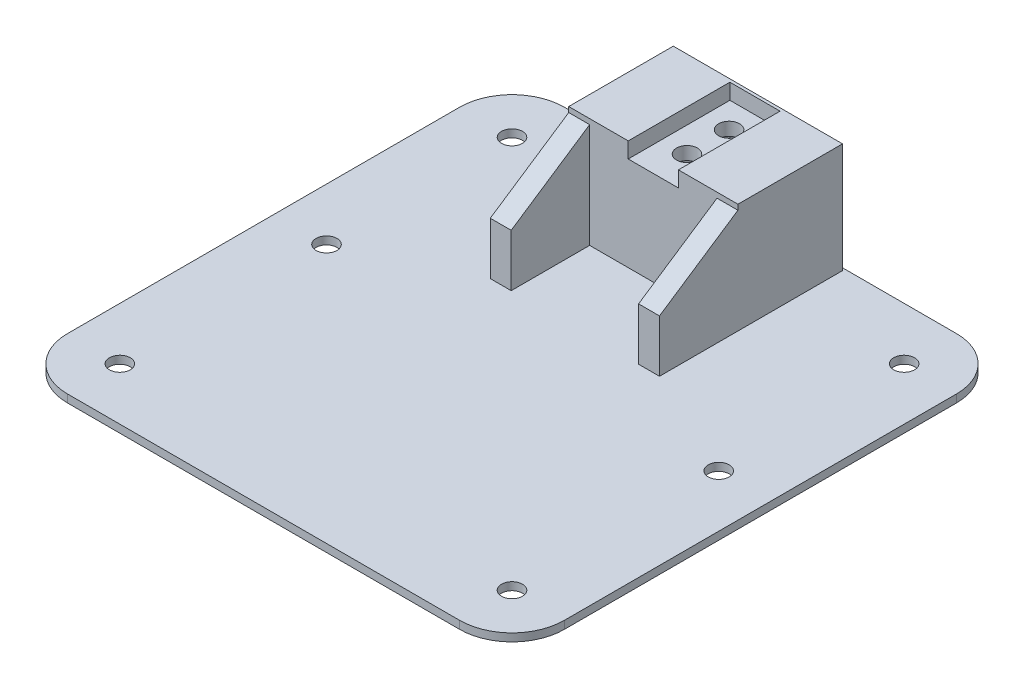
ISO-10303-21;
HEADER;
FILE_DESCRIPTION(('STEP AP214'),'2;1');
FILE_NAME('part.step','',(''),(''),'','','');
FILE_SCHEMA(('AUTOMOTIVE_DESIGN { 1 0 10303 214 1 1 1 1 }'));
ENDSEC;
DATA;
#1=APPLICATION_CONTEXT('core data for automotive mechanical design processes');
#2=APPLICATION_PROTOCOL_DEFINITION('international standard','automotive_design',2000,#1);
#3=PRODUCT_CONTEXT('',#1,'mechanical');
#4=PRODUCT('Part','Part','',(#3));
#5=PRODUCT_RELATED_PRODUCT_CATEGORY('part','',(#4));
#6=PRODUCT_DEFINITION_FORMATION('','',#4);
#7=PRODUCT_DEFINITION_CONTEXT('part definition',#1,'design');
#8=PRODUCT_DEFINITION('design','',#6,#7);
#9=PRODUCT_DEFINITION_SHAPE('','',#8);
#10=(LENGTH_UNIT() NAMED_UNIT(*) SI_UNIT(.MILLI.,.METRE.));
#11=(NAMED_UNIT(*) PLANE_ANGLE_UNIT() SI_UNIT($,.RADIAN.));
#12=(NAMED_UNIT(*) SI_UNIT($,.STERADIAN.) SOLID_ANGLE_UNIT());
#13=UNCERTAINTY_MEASURE_WITH_UNIT(LENGTH_MEASURE(1.E-05),#10,'distance_accuracy_value','');
#14=(GEOMETRIC_REPRESENTATION_CONTEXT(3) GLOBAL_UNCERTAINTY_ASSIGNED_CONTEXT((#13)) GLOBAL_UNIT_ASSIGNED_CONTEXT((#10,
#11,#12)) REPRESENTATION_CONTEXT('',''));
#15=CARTESIAN_POINT('',(0.,0.,0.));
#16=DIRECTION('',(0.,0.,1.));
#17=DIRECTION('',(1.,0.,0.));
#18=AXIS2_PLACEMENT_3D('',#15,#16,#17);
#19=CARTESIAN_POINT('',(-37.5,1.5,142.316917970515));
#20=DIRECTION('',(0.,-1.,0.));
#21=DIRECTION('',(0.,0.,-1.));
#22=AXIS2_PLACEMENT_3D('',#19,#20,#21);
#23=PLANE('',#22);
#24=CARTESIAN_POINT('',(37.5,1.5,67.3169179705147));
#25=DIRECTION('',(0.,-1.,0.));
#26=DIRECTION('',(0.,0.,-1.));
#27=AXIS2_PLACEMENT_3D('',#24,#25,#26);
#28=CIRCLE('',#27,2.);
#29=CARTESIAN_POINT('',(37.5,1.5,65.3169179705147));
#30=VERTEX_POINT('',#29);
#31=EDGE_CURVE('E249',#30,#30,#28,.T.);
#32=ORIENTED_EDGE('',*,*,#31,.T.);
#33=EDGE_LOOP('',(#32));
#34=FACE_BOUND('',#33,.T.);
#35=CARTESIAN_POINT('',(37.5,1.5,102.789636978627));
#36=DIRECTION('',(0.,-1.,0.));
#37=DIRECTION('',(0.,0.,-1.));
#38=AXIS2_PLACEMENT_3D('',#35,#36,#37);
#39=CIRCLE('',#38,2.);
#40=CARTESIAN_POINT('',(37.5,1.5,100.789636978627));
#41=VERTEX_POINT('',#40);
#42=EDGE_CURVE('E456',#41,#41,#39,.T.);
#43=ORIENTED_EDGE('',*,*,#42,.T.);
#44=EDGE_LOOP('',(#43));
#45=FACE_BOUND('',#44,.T.);
#46=CARTESIAN_POINT('',(37.5,1.5,142.316917970515));
#47=DIRECTION('',(0.,-1.,0.));
#48=DIRECTION('',(0.,0.,-1.));
#49=AXIS2_PLACEMENT_3D('',#46,#47,#48);
#50=CIRCLE('',#49,2.);
#51=CARTESIAN_POINT('',(37.5,1.5,140.316917970515));
#52=VERTEX_POINT('',#51);
#53=EDGE_CURVE('E459',#52,#52,#50,.T.);
#54=ORIENTED_EDGE('',*,*,#53,.T.);
#55=EDGE_LOOP('',(#54));
#56=FACE_BOUND('',#55,.T.);
#57=CARTESIAN_POINT('',(-37.5,1.5,142.316917970515));
#58=DIRECTION('',(0.,-1.,0.));
#59=DIRECTION('',(0.,0.,-1.));
#60=AXIS2_PLACEMENT_3D('',#57,#58,#59);
#61=CIRCLE('',#60,2.);
#62=CARTESIAN_POINT('',(-37.5,1.5,140.316917970515));
#63=VERTEX_POINT('',#62);
#64=EDGE_CURVE('E455',#63,#63,#61,.T.);
#65=ORIENTED_EDGE('',*,*,#64,.T.);
#66=EDGE_LOOP('',(#65));
#67=FACE_BOUND('',#66,.T.);
#68=CARTESIAN_POINT('',(-37.5,1.5,102.789636978627));
#69=DIRECTION('',(0.,-1.,0.));
#70=DIRECTION('',(0.,0.,-1.));
#71=AXIS2_PLACEMENT_3D('',#68,#69,#70);
#72=CIRCLE('',#71,2.);
#73=CARTESIAN_POINT('',(-37.5,1.5,100.789636978627));
#74=VERTEX_POINT('',#73);
#75=EDGE_CURVE('E453',#74,#74,#72,.T.);
#76=ORIENTED_EDGE('',*,*,#75,.T.);
#77=EDGE_LOOP('',(#76));
#78=FACE_BOUND('',#77,.T.);
#79=CARTESIAN_POINT('',(-37.5,1.5,67.3169179705147));
#80=DIRECTION('',(0.,-1.,0.));
#81=DIRECTION('',(0.,0.,-1.));
#82=AXIS2_PLACEMENT_3D('',#79,#80,#81);
#83=CIRCLE('',#82,2.);
#84=CARTESIAN_POINT('',(-37.5,1.5,65.3169179705147));
#85=VERTEX_POINT('',#84);
#86=EDGE_CURVE('E436',#85,#85,#83,.T.);
#87=ORIENTED_EDGE('',*,*,#86,.T.);
#88=EDGE_LOOP('',(#87));
#89=FACE_BOUND('',#88,.T.);
#90=DIRECTION('',(0.,0.,-1.));
#91=VECTOR('',#90,1.);
#92=CARTESIAN_POINT('',(16.180268475215,1.5,77.7896369786268));
#93=LINE('',#92,#91);
#94=CARTESIAN_POINT('',(16.180268475215,1.5,92.7896369786267));
#95=VERTEX_POINT('',#94);
#96=CARTESIAN_POINT('',(16.180268475215,1.5,57.7896369786268));
#97=VERTEX_POINT('',#96);
#98=EDGE_CURVE('E355',#95,#97,#93,.T.);
#99=ORIENTED_EDGE('',*,*,#98,.F.);
#100=DIRECTION('',(-1.,0.,0.));
#101=VECTOR('',#100,1.);
#102=CARTESIAN_POINT('',(16.180268475215,1.5,92.7896369786267));
#103=LINE('',#102,#101);
#104=CARTESIAN_POINT('',(12.180268475215,1.5,92.7896369786267));
#105=VERTEX_POINT('',#104);
#106=EDGE_CURVE('E284',#95,#105,#103,.T.);
#107=ORIENTED_EDGE('',*,*,#106,.T.);
#108=DIRECTION('',(0.,0.,1.));
#109=VECTOR('',#108,1.);
#110=CARTESIAN_POINT('',(12.1802684752149,1.5,77.7896369786268));
#111=LINE('',#110,#109);
#112=CARTESIAN_POINT('',(12.1802684752149,1.5,77.7896369786268));
#113=VERTEX_POINT('',#112);
#114=EDGE_CURVE('E300',#113,#105,#111,.T.);
#115=ORIENTED_EDGE('',*,*,#114,.F.);
#116=DIRECTION('',(1.,0.,0.));
#117=VECTOR('',#116,1.);
#118=CARTESIAN_POINT('',(16.180268475215,1.5,77.7896369786268));
#119=LINE('',#118,#117);
#120=CARTESIAN_POINT('',(-12.180268475215,1.5,77.7896369786268));
#121=VERTEX_POINT('',#120);
#122=EDGE_CURVE('E346',#121,#113,#119,.T.);
#123=ORIENTED_EDGE('',*,*,#122,.F.);
#124=DIRECTION('',(0.,0.,1.));
#125=VECTOR('',#124,1.);
#126=CARTESIAN_POINT('',(-12.180268475215,1.5,77.7896369786268));
#127=LINE('',#126,#125);
#128=CARTESIAN_POINT('',(-12.180268475215,1.5,92.7896369786268));
#129=VERTEX_POINT('',#128);
#130=EDGE_CURVE('E277',#121,#129,#127,.T.);
#131=ORIENTED_EDGE('',*,*,#130,.T.);
#132=DIRECTION('',(1.,0.,0.));
#133=VECTOR('',#132,1.);
#134=CARTESIAN_POINT('',(-16.180268475215,1.5,92.7896369786268));
#135=LINE('',#134,#133);
#136=CARTESIAN_POINT('',(-16.180268475215,1.5,92.7896369786268));
#137=VERTEX_POINT('',#136);
#138=EDGE_CURVE('E280',#137,#129,#135,.T.);
#139=ORIENTED_EDGE('',*,*,#138,.F.);
#140=DIRECTION('',(0.,0.,1.));
#141=VECTOR('',#140,1.);
#142=CARTESIAN_POINT('',(-16.180268475215,1.5,77.7896369786268));
#143=LINE('',#142,#141);
#144=CARTESIAN_POINT('',(-16.180268475215,1.5,57.7896369786268));
#145=VERTEX_POINT('',#144);
#146=EDGE_CURVE('E343',#145,#137,#143,.T.);
#147=ORIENTED_EDGE('',*,*,#146,.F.);
#148=DIRECTION('',(-1.,0.,0.));
#149=VECTOR('',#148,1.);
#150=CARTESIAN_POINT('',(16.180268475215,1.5,57.7896369786268));
#151=LINE('',#150,#149);
#152=EDGE_CURVE('E347',#97,#145,#151,.T.);
#153=ORIENTED_EDGE('',*,*,#152,.F.);
#154=EDGE_LOOP('',(#99,#107,#115,#123,#131,#139,#147,#153));
#155=FACE_BOUND('',#154,.T.);
#156=CARTESIAN_POINT('',(-37.5,1.5,142.316917970515));
#157=DIRECTION('',(0.,-1.,0.));
#158=DIRECTION('',(0.,0.,-1.));
#159=AXIS2_PLACEMENT_3D('',#156,#157,#158);
#160=CIRCLE('',#159,9.99999999999999);
#161=CARTESIAN_POINT('',(-37.4999999999999,1.5,152.316917970515));
#162=VERTEX_POINT('',#161);
#163=CARTESIAN_POINT('',(-47.5,1.5,142.316917970515));
#164=VERTEX_POINT('',#163);
#165=EDGE_CURVE('E367',#162,#164,#160,.T.);
#166=ORIENTED_EDGE('',*,*,#165,.F.);
#167=DIRECTION('',(1.,0.,0.));
#168=VECTOR('',#167,1.);
#169=CARTESIAN_POINT('',(-37.4999999999999,1.5,152.316917970515));
#170=LINE('',#169,#168);
#171=CARTESIAN_POINT('',(37.4999999999999,1.5,152.316917970515));
#172=VERTEX_POINT('',#171);
#173=EDGE_CURVE('E390',#162,#172,#170,.T.);
#174=ORIENTED_EDGE('',*,*,#173,.T.);
#175=CARTESIAN_POINT('',(37.5,1.5,142.316917970515));
#176=DIRECTION('',(0.,1.,0.));
#177=DIRECTION('',(0.,0.,1.));
#178=AXIS2_PLACEMENT_3D('',#175,#176,#177);
#179=CIRCLE('',#178,9.99999999999999);
#180=CARTESIAN_POINT('',(47.5,1.5,142.316917970515));
#181=VERTEX_POINT('',#180);
#182=EDGE_CURVE('E389',#172,#181,#179,.T.);
#183=ORIENTED_EDGE('',*,*,#182,.T.);
#184=DIRECTION('',(0.,0.,-1.));
#185=VECTOR('',#184,1.);
#186=CARTESIAN_POINT('',(47.5,1.5,142.316917970515));
#187=LINE('',#186,#185);
#188=CARTESIAN_POINT('',(47.5,1.5,67.3169179705148));
#189=VERTEX_POINT('',#188);
#190=EDGE_CURVE('E383',#181,#189,#187,.T.);
#191=ORIENTED_EDGE('',*,*,#190,.T.);
#192=CARTESIAN_POINT('',(37.5,1.5,67.3169179705147));
#193=DIRECTION('',(0.,-1.,0.));
#194=DIRECTION('',(0.,0.,-1.));
#195=AXIS2_PLACEMENT_3D('',#192,#193,#194);
#196=CIRCLE('',#195,10.);
#197=CARTESIAN_POINT('',(37.4999999999999,1.5,57.3169179705147));
#198=VERTEX_POINT('',#197);
#199=EDGE_CURVE('E385',#198,#189,#196,.T.);
#200=ORIENTED_EDGE('',*,*,#199,.F.);
#201=DIRECTION('',(1.,0.,0.));
#202=VECTOR('',#201,1.);
#203=CARTESIAN_POINT('',(-37.4999999999999,1.5,57.3169179705147));
#204=LINE('',#203,#202);
#205=CARTESIAN_POINT('',(-37.5,1.5,57.3169179705147));
#206=VERTEX_POINT('',#205);
#207=EDGE_CURVE('E378',#206,#198,#204,.T.);
#208=ORIENTED_EDGE('',*,*,#207,.F.);
#209=CARTESIAN_POINT('',(-37.5,1.5,67.3169179705147));
#210=DIRECTION('',(0.,-1.,0.));
#211=DIRECTION('',(0.,0.,-1.));
#212=AXIS2_PLACEMENT_3D('',#209,#210,#211);
#213=CIRCLE('',#212,9.99999999999999);
#214=CARTESIAN_POINT('',(-47.5,1.5,67.3169179705148));
#215=VERTEX_POINT('',#214);
#216=EDGE_CURVE('E376',#215,#206,#213,.T.);
#217=ORIENTED_EDGE('',*,*,#216,.F.);
#218=DIRECTION('',(0.,0.,-1.));
#219=VECTOR('',#218,1.);
#220=CARTESIAN_POINT('',(-47.5,1.5,142.316917970515));
#221=LINE('',#220,#219);
#222=EDGE_CURVE('E375',#164,#215,#221,.T.);
#223=ORIENTED_EDGE('',*,*,#222,.F.);
#224=EDGE_LOOP('',(#166,#174,#183,#191,#200,#208,#217,#223));
#225=FACE_BOUND('',#224,.T.);
#226=ADVANCED_FACE('F48',(#34,#45,#56,#67,#78,#89,#155,#225),#23,.F.);
#227=CARTESIAN_POINT('',(-37.5,0.,142.316917970515));
#228=DIRECTION('',(0.,-1.,0.));
#229=DIRECTION('',(0.,0.,-1.));
#230=AXIS2_PLACEMENT_3D('',#227,#228,#229);
#231=PLANE('',#230);
#232=CARTESIAN_POINT('',(37.5,0.,67.3169179705147));
#233=DIRECTION('',(0.,1.,0.));
#234=DIRECTION('',(0.,0.,1.));
#235=AXIS2_PLACEMENT_3D('',#232,#233,#234);
#236=CIRCLE('',#235,2.);
#237=CARTESIAN_POINT('',(37.5,0.,69.3169179705147));
#238=VERTEX_POINT('',#237);
#239=EDGE_CURVE('E704',#238,#238,#236,.T.);
#240=ORIENTED_EDGE('',*,*,#239,.T.);
#241=EDGE_LOOP('',(#240));
#242=FACE_BOUND('',#241,.T.);
#243=CARTESIAN_POINT('',(37.5,0.,102.789636978627));
#244=DIRECTION('',(0.,1.,0.));
#245=DIRECTION('',(0.,0.,1.));
#246=AXIS2_PLACEMENT_3D('',#243,#244,#245);
#247=CIRCLE('',#246,2.);
#248=CARTESIAN_POINT('',(37.5,0.,104.789636978627));
#249=VERTEX_POINT('',#248);
#250=EDGE_CURVE('E450',#249,#249,#247,.T.);
#251=ORIENTED_EDGE('',*,*,#250,.T.);
#252=EDGE_LOOP('',(#251));
#253=FACE_BOUND('',#252,.T.);
#254=CARTESIAN_POINT('',(37.5,0.,142.316917970515));
#255=DIRECTION('',(0.,1.,0.));
#256=DIRECTION('',(0.,0.,1.));
#257=AXIS2_PLACEMENT_3D('',#254,#255,#256);
#258=CIRCLE('',#257,2.);
#259=CARTESIAN_POINT('',(37.5,0.,144.316917970515));
#260=VERTEX_POINT('',#259);
#261=EDGE_CURVE('E695',#260,#260,#258,.T.);
#262=ORIENTED_EDGE('',*,*,#261,.T.);
#263=EDGE_LOOP('',(#262));
#264=FACE_BOUND('',#263,.T.);
#265=CARTESIAN_POINT('',(-37.5,0.,142.316917970515));
#266=DIRECTION('',(0.,1.,0.));
#267=DIRECTION('',(0.,0.,1.));
#268=AXIS2_PLACEMENT_3D('',#265,#266,#267);
#269=CIRCLE('',#268,2.);
#270=CARTESIAN_POINT('',(-37.5,0.,144.316917970515));
#271=VERTEX_POINT('',#270);
#272=EDGE_CURVE('E705',#271,#271,#269,.T.);
#273=ORIENTED_EDGE('',*,*,#272,.T.);
#274=EDGE_LOOP('',(#273));
#275=FACE_BOUND('',#274,.T.);
#276=CARTESIAN_POINT('',(-37.5,0.,102.789636978627));
#277=DIRECTION('',(0.,1.,0.));
#278=DIRECTION('',(0.,0.,1.));
#279=AXIS2_PLACEMENT_3D('',#276,#277,#278);
#280=CIRCLE('',#279,2.);
#281=CARTESIAN_POINT('',(-37.5,0.,104.789636978627));
#282=VERTEX_POINT('',#281);
#283=EDGE_CURVE('E710',#282,#282,#280,.T.);
#284=ORIENTED_EDGE('',*,*,#283,.T.);
#285=EDGE_LOOP('',(#284));
#286=FACE_BOUND('',#285,.T.);
#287=CARTESIAN_POINT('',(-37.5,0.,67.3169179705147));
#288=DIRECTION('',(0.,1.,0.));
#289=DIRECTION('',(0.,0.,1.));
#290=AXIS2_PLACEMENT_3D('',#287,#288,#289);
#291=CIRCLE('',#290,2.);
#292=CARTESIAN_POINT('',(-37.5,0.,69.3169179705147));
#293=VERTEX_POINT('',#292);
#294=EDGE_CURVE('E435',#293,#293,#291,.T.);
#295=ORIENTED_EDGE('',*,*,#294,.T.);
#296=EDGE_LOOP('',(#295));
#297=FACE_BOUND('',#296,.T.);
#298=DIRECTION('',(0.,0.,-1.));
#299=VECTOR('',#298,1.);
#300=CARTESIAN_POINT('',(-4.75630829071007,0.,58.3496369786268));
#301=LINE('',#300,#299);
#302=CARTESIAN_POINT('',(-4.75630829071007,0.,76.3496369786268));
#303=VERTEX_POINT('',#302);
#304=CARTESIAN_POINT('',(-4.75630829071007,0.,58.3496369786268));
#305=VERTEX_POINT('',#304);
#306=EDGE_CURVE('E61',#303,#305,#301,.T.);
#307=ORIENTED_EDGE('',*,*,#306,.F.);
#308=DIRECTION('',(-1.,0.,0.));
#309=VECTOR('',#308,1.);
#310=CARTESIAN_POINT('',(-4.75630829071007,0.,76.3496369786268));
#311=LINE('',#310,#309);
#312=CARTESIAN_POINT('',(4.8,0.,76.3496369786268));
#313=VERTEX_POINT('',#312);
#314=EDGE_CURVE('E242',#313,#303,#311,.T.);
#315=ORIENTED_EDGE('',*,*,#314,.F.);
#316=DIRECTION('',(0.,0.,1.));
#317=VECTOR('',#316,1.);
#318=CARTESIAN_POINT('',(4.8,0.,58.3496369786268));
#319=LINE('',#318,#317);
#320=CARTESIAN_POINT('',(4.8,0.,58.3496369786268));
#321=VERTEX_POINT('',#320);
#322=EDGE_CURVE('E250',#321,#313,#319,.T.);
#323=ORIENTED_EDGE('',*,*,#322,.F.);
#324=DIRECTION('',(1.,0.,0.));
#325=VECTOR('',#324,1.);
#326=CARTESIAN_POINT('',(-4.75630829071007,0.,58.3496369786268));
#327=LINE('',#326,#325);
#328=EDGE_CURVE('E258',#305,#321,#327,.T.);
#329=ORIENTED_EDGE('',*,*,#328,.F.);
#330=EDGE_LOOP('',(#307,#315,#323,#329));
#331=FACE_BOUND('',#330,.T.);
#332=CARTESIAN_POINT('',(-37.5,0.,142.316917970515));
#333=DIRECTION('',(0.,-1.,0.));
#334=DIRECTION('',(0.,0.,-1.));
#335=AXIS2_PLACEMENT_3D('',#332,#333,#334);
#336=CIRCLE('',#335,9.99999999999999);
#337=CARTESIAN_POINT('',(-37.4999999999999,0.,152.316917970515));
#338=VERTEX_POINT('',#337);
#339=CARTESIAN_POINT('',(-47.5,0.,142.316917970515));
#340=VERTEX_POINT('',#339);
#341=EDGE_CURVE('E368',#338,#340,#336,.T.);
#342=ORIENTED_EDGE('',*,*,#341,.T.);
#343=DIRECTION('',(0.,0.,-1.));
#344=VECTOR('',#343,1.);
#345=CARTESIAN_POINT('',(-47.5,0.,142.316917970515));
#346=LINE('',#345,#344);
#347=CARTESIAN_POINT('',(-47.5,0.,67.3169179705148));
#348=VERTEX_POINT('',#347);
#349=EDGE_CURVE('E391',#340,#348,#346,.T.);
#350=ORIENTED_EDGE('',*,*,#349,.T.);
#351=CARTESIAN_POINT('',(-37.5,0.,67.3169179705147));
#352=DIRECTION('',(0.,-1.,0.));
#353=DIRECTION('',(0.,0.,-1.));
#354=AXIS2_PLACEMENT_3D('',#351,#352,#353);
#355=CIRCLE('',#354,9.99999999999999);
#356=CARTESIAN_POINT('',(-37.5,0.,57.3169179705147));
#357=VERTEX_POINT('',#356);
#358=EDGE_CURVE('E400',#348,#357,#355,.T.);
#359=ORIENTED_EDGE('',*,*,#358,.T.);
#360=DIRECTION('',(1.,0.,0.));
#361=VECTOR('',#360,1.);
#362=CARTESIAN_POINT('',(-37.4999999999999,0.,57.3169179705147));
#363=LINE('',#362,#361);
#364=CARTESIAN_POINT('',(37.4999999999999,0.,57.3169179705147));
#365=VERTEX_POINT('',#364);
#366=EDGE_CURVE('E399',#357,#365,#363,.T.);
#367=ORIENTED_EDGE('',*,*,#366,.T.);
#368=CARTESIAN_POINT('',(37.5,0.,67.3169179705147));
#369=DIRECTION('',(0.,-1.,0.));
#370=DIRECTION('',(0.,0.,-1.));
#371=AXIS2_PLACEMENT_3D('',#368,#369,#370);
#372=CIRCLE('',#371,10.);
#373=CARTESIAN_POINT('',(47.5,0.,67.3169179705148));
#374=VERTEX_POINT('',#373);
#375=EDGE_CURVE('E401',#365,#374,#372,.T.);
#376=ORIENTED_EDGE('',*,*,#375,.T.);
#377=DIRECTION('',(0.,0.,-1.));
#378=VECTOR('',#377,1.);
#379=CARTESIAN_POINT('',(47.5,0.,142.316917970515));
#380=LINE('',#379,#378);
#381=CARTESIAN_POINT('',(47.5,0.,142.316917970515));
#382=VERTEX_POINT('',#381);
#383=EDGE_CURVE('E408',#382,#374,#380,.T.);
#384=ORIENTED_EDGE('',*,*,#383,.F.);
#385=CARTESIAN_POINT('',(37.5,0.,142.316917970515));
#386=DIRECTION('',(0.,1.,0.));
#387=DIRECTION('',(0.,0.,1.));
#388=AXIS2_PLACEMENT_3D('',#385,#386,#387);
#389=CIRCLE('',#388,9.99999999999999);
#390=CARTESIAN_POINT('',(37.4999999999999,0.,152.316917970515));
#391=VERTEX_POINT('',#390);
#392=EDGE_CURVE('E410',#391,#382,#389,.T.);
#393=ORIENTED_EDGE('',*,*,#392,.F.);
#394=DIRECTION('',(1.,0.,0.));
#395=VECTOR('',#394,1.);
#396=CARTESIAN_POINT('',(-37.4999999999999,0.,152.316917970515));
#397=LINE('',#396,#395);
#398=EDGE_CURVE('E373',#338,#391,#397,.T.);
#399=ORIENTED_EDGE('',*,*,#398,.F.);
#400=EDGE_LOOP('',(#342,#350,#359,#367,#376,#384,#393,#399));
#401=FACE_BOUND('',#400,.T.);
#402=ADVANCED_FACE('F481',(#242,#253,#264,#275,#286,#297,#331,#401),#231,.T.);
#403=CARTESIAN_POINT('',(16.180268475215,19.5,77.7896369786268));
#404=DIRECTION('',(-1.,0.,0.));
#405=DIRECTION('',(0.,0.,1.));
#406=AXIS2_PLACEMENT_3D('',#403,#404,#405);
#407=PLANE('',#406);
#408=DIRECTION('',(0.,0.554700196225229,-0.832050294337844));
#409=VECTOR('',#408,1.);
#410=CARTESIAN_POINT('',(16.180268475215,21.5,77.7896369786267));
#411=LINE('',#410,#409);
#412=CARTESIAN_POINT('',(16.180268475215,11.5,92.7896369786267));
#413=VERTEX_POINT('',#412);
#414=CARTESIAN_POINT('',(16.180268475215,21.5,77.7896369786267));
#415=VERTEX_POINT('',#414);
#416=EDGE_CURVE('E267',#413,#415,#411,.T.);
#417=ORIENTED_EDGE('',*,*,#416,.F.);
#418=DIRECTION('',(0.,-1.,0.));
#419=VECTOR('',#418,1.);
#420=CARTESIAN_POINT('',(16.180268475215,21.5,92.7896369786267));
#421=LINE('',#420,#419);
#422=EDGE_CURVE('E293',#413,#95,#421,.T.);
#423=ORIENTED_EDGE('',*,*,#422,.T.);
#424=ORIENTED_EDGE('',*,*,#98,.T.);
#425=DIRECTION('',(0.,-1.,0.));
#426=VECTOR('',#425,1.);
#427=CARTESIAN_POINT('',(16.180268475215,19.5,57.7896369786268));
#428=LINE('',#427,#426);
#429=CARTESIAN_POINT('',(16.180268475215,22.5,57.7896369786268));
#430=VERTEX_POINT('',#429);
#431=EDGE_CURVE('E360',#430,#97,#428,.T.);
#432=ORIENTED_EDGE('',*,*,#431,.F.);
#433=DIRECTION('',(0.,0.,-1.));
#434=VECTOR('',#433,1.);
#435=CARTESIAN_POINT('',(16.180268475215,22.5,0.));
#436=LINE('',#435,#434);
#437=CARTESIAN_POINT('',(16.180268475215,22.5,77.7896369786268));
#438=VERTEX_POINT('',#437);
#439=EDGE_CURVE('E324',#438,#430,#436,.T.);
#440=ORIENTED_EDGE('',*,*,#439,.F.);
#441=DIRECTION('',(0.,-1.,0.));
#442=VECTOR('',#441,1.);
#443=CARTESIAN_POINT('',(16.180268475215,19.5,77.7896369786268));
#444=LINE('',#443,#442);
#445=EDGE_CURVE('E365',#438,#415,#444,.T.);
#446=ORIENTED_EDGE('',*,*,#445,.T.);
#447=EDGE_LOOP('',(#417,#423,#424,#432,#440,#446));
#448=FACE_BOUND('',#447,.T.);
#449=ADVANCED_FACE('F487',(#448),#407,.F.);
#450=CARTESIAN_POINT('',(16.180268475215,21.5,92.7896369786267));
#451=DIRECTION('',(0.,0.,1.));
#452=DIRECTION('',(1.,0.,0.));
#453=AXIS2_PLACEMENT_3D('',#450,#451,#452);
#454=PLANE('',#453);
#455=ORIENTED_EDGE('',*,*,#422,.F.);
#456=DIRECTION('',(-1.,0.,0.));
#457=VECTOR('',#456,1.);
#458=CARTESIAN_POINT('',(226.907598736068,11.5,92.7896369786267));
#459=LINE('',#458,#457);
#460=CARTESIAN_POINT('',(12.1802684752149,11.5,92.7896369786267));
#461=VERTEX_POINT('',#460);
#462=EDGE_CURVE('E269',#413,#461,#459,.T.);
#463=ORIENTED_EDGE('',*,*,#462,.T.);
#464=DIRECTION('',(0.,-1.,0.));
#465=VECTOR('',#464,1.);
#466=CARTESIAN_POINT('',(12.180268475215,21.5,92.7896369786267));
#467=LINE('',#466,#465);
#468=EDGE_CURVE('E295',#461,#105,#467,.T.);
#469=ORIENTED_EDGE('',*,*,#468,.T.);
#470=ORIENTED_EDGE('',*,*,#106,.F.);
#471=EDGE_LOOP('',(#455,#463,#469,#470));
#472=FACE_BOUND('',#471,.T.);
#473=ADVANCED_FACE('F557',(#472),#454,.T.);
#474=CARTESIAN_POINT('',(16.180268475215,19.5,77.7896369786268));
#475=DIRECTION('',(0.,0.,-1.));
#476=DIRECTION('',(-1.,0.,0.));
#477=AXIS2_PLACEMENT_3D('',#474,#475,#476);
#478=PLANE('',#477);
#479=DIRECTION('',(0.,-1.,0.));
#480=VECTOR('',#479,1.);
#481=CARTESIAN_POINT('',(12.1802684752149,21.5,77.7896369786268));
#482=LINE('',#481,#480);
#483=CARTESIAN_POINT('',(12.1802684752149,21.5,77.7896369786268));
#484=VERTEX_POINT('',#483);
#485=EDGE_CURVE('E271',#484,#113,#482,.T.);
#486=ORIENTED_EDGE('',*,*,#485,.F.);
#487=DIRECTION('',(-1.,0.,0.));
#488=VECTOR('',#487,1.);
#489=CARTESIAN_POINT('',(16.1802684752149,21.5,77.7896369786267));
#490=LINE('',#489,#488);
#491=EDGE_CURVE('E291',#415,#484,#490,.T.);
#492=ORIENTED_EDGE('',*,*,#491,.F.);
#493=ORIENTED_EDGE('',*,*,#445,.F.);
#494=DIRECTION('',(1.,0.,0.));
#495=VECTOR('',#494,1.);
#496=CARTESIAN_POINT('',(0.,22.5,77.7896369786268));
#497=LINE('',#496,#495);
#498=CARTESIAN_POINT('',(4.8,22.5,77.7896369786268));
#499=VERTEX_POINT('',#498);
#500=EDGE_CURVE('E316',#499,#438,#497,.T.);
#501=ORIENTED_EDGE('',*,*,#500,.F.);
#502=DIRECTION('',(0.,-1.,0.));
#503=VECTOR('',#502,1.);
#504=CARTESIAN_POINT('',(4.8,22.5,77.7896369786268));
#505=LINE('',#504,#503);
#506=CARTESIAN_POINT('',(4.8,19.5,77.7896369786268));
#507=VERTEX_POINT('',#506);
#508=EDGE_CURVE('E321',#499,#507,#505,.T.);
#509=ORIENTED_EDGE('',*,*,#508,.T.);
#510=DIRECTION('',(1.,0.,0.));
#511=VECTOR('',#510,1.);
#512=CARTESIAN_POINT('',(16.180268475215,19.5,77.7896369786268));
#513=LINE('',#512,#511);
#514=CARTESIAN_POINT('',(-4.8,19.5,77.7896369786268));
#515=VERTEX_POINT('',#514);
#516=EDGE_CURVE('E344',#515,#507,#513,.T.);
#517=ORIENTED_EDGE('',*,*,#516,.F.);
#518=DIRECTION('',(0.,-1.,0.));
#519=VECTOR('',#518,1.);
#520=CARTESIAN_POINT('',(-4.8,22.5,77.7896369786268));
#521=LINE('',#520,#519);
#522=CARTESIAN_POINT('',(-4.8,22.5,77.7896369786268));
#523=VERTEX_POINT('',#522);
#524=EDGE_CURVE('E339',#523,#515,#521,.T.);
#525=ORIENTED_EDGE('',*,*,#524,.F.);
#526=DIRECTION('',(1.,0.,0.));
#527=VECTOR('',#526,1.);
#528=CARTESIAN_POINT('',(0.,22.5,77.7896369786268));
#529=LINE('',#528,#527);
#530=CARTESIAN_POINT('',(-16.180268475215,22.5,77.7896369786268));
#531=VERTEX_POINT('',#530);
#532=EDGE_CURVE('E309',#531,#523,#529,.T.);
#533=ORIENTED_EDGE('',*,*,#532,.F.);
#534=DIRECTION('',(0.,-1.,0.));
#535=VECTOR('',#534,1.);
#536=CARTESIAN_POINT('',(-16.180268475215,19.5,77.7896369786268));
#537=LINE('',#536,#535);
#538=CARTESIAN_POINT('',(-16.180268475215,21.5,77.7896369786268));
#539=VERTEX_POINT('',#538);
#540=EDGE_CURVE('E362',#531,#539,#537,.T.);
#541=ORIENTED_EDGE('',*,*,#540,.T.);
#542=DIRECTION('',(1.,0.,0.));
#543=VECTOR('',#542,1.);
#544=CARTESIAN_POINT('',(-16.180268475215,21.5,77.7896369786268));
#545=LINE('',#544,#543);
#546=CARTESIAN_POINT('',(-12.180268475215,21.5,77.7896369786267));
#547=VERTEX_POINT('',#546);
#548=EDGE_CURVE('E274',#539,#547,#545,.T.);
#549=ORIENTED_EDGE('',*,*,#548,.T.);
#550=DIRECTION('',(0.,-1.,0.));
#551=VECTOR('',#550,1.);
#552=CARTESIAN_POINT('',(-12.180268475215,21.5,77.7896369786268));
#553=LINE('',#552,#551);
#554=EDGE_CURVE('E286',#547,#121,#553,.T.);
#555=ORIENTED_EDGE('',*,*,#554,.T.);
#556=ORIENTED_EDGE('',*,*,#122,.T.);
#557=EDGE_LOOP('',(#486,#492,#493,#501,#509,#517,#525,#533,#541,#549,#555,#556));
#558=FACE_BOUND('',#557,.T.);
#559=ADVANCED_FACE('F551',(#558),#478,.F.);
#560=CARTESIAN_POINT('',(0.,19.5,0.));
#561=DIRECTION('',(0.,1.,0.));
#562=DIRECTION('',(0.,0.,1.));
#563=AXIS2_PLACEMENT_3D('',#560,#561,#562);
#564=PLANE('',#563);
#565=CARTESIAN_POINT('',(0.,19.5,63.3039230169717));
#566=DIRECTION('',(0.,1.,0.));
#567=DIRECTION('',(0.,0.,1.));
#568=AXIS2_PLACEMENT_3D('',#565,#566,#567);
#569=CIRCLE('',#568,2.00000000000001);
#570=CARTESIAN_POINT('',(0.,19.5,65.3039230169717));
#571=VERTEX_POINT('',#570);
#572=EDGE_CURVE('E438',#571,#571,#569,.T.);
#573=ORIENTED_EDGE('',*,*,#572,.F.);
#574=EDGE_LOOP('',(#573));
#575=FACE_BOUND('',#574,.T.);
#576=CARTESIAN_POINT('',(0.,19.5,71.3523832999657));
#577=DIRECTION('',(0.,1.,0.));
#578=DIRECTION('',(0.,0.,1.));
#579=AXIS2_PLACEMENT_3D('',#576,#577,#578);
#580=CIRCLE('',#579,2.00000000000001);
#581=CARTESIAN_POINT('',(0.,19.5,73.3523832999657));
#582=VERTEX_POINT('',#581);
#583=EDGE_CURVE('E442',#582,#582,#580,.T.);
#584=ORIENTED_EDGE('',*,*,#583,.F.);
#585=EDGE_LOOP('',(#584));
#586=FACE_BOUND('',#585,.T.);
#587=ORIENTED_EDGE('',*,*,#516,.T.);
#588=DIRECTION('',(0.,0.,-1.));
#589=VECTOR('',#588,1.);
#590=CARTESIAN_POINT('',(4.8,19.5,0.));
#591=LINE('',#590,#589);
#592=CARTESIAN_POINT('',(4.8,19.5,58.3496369786268));
#593=VERTEX_POINT('',#592);
#594=EDGE_CURVE('E310',#507,#593,#591,.T.);
#595=ORIENTED_EDGE('',*,*,#594,.T.);
#596=DIRECTION('',(1.,0.,0.));
#597=VECTOR('',#596,1.);
#598=CARTESIAN_POINT('',(0.,19.5,58.3496369786268));
#599=LINE('',#598,#597);
#600=CARTESIAN_POINT('',(-4.8,19.5,58.3496369786268));
#601=VERTEX_POINT('',#600);
#602=EDGE_CURVE('E330',#601,#593,#599,.T.);
#603=ORIENTED_EDGE('',*,*,#602,.F.);
#604=DIRECTION('',(0.,0.,-1.));
#605=VECTOR('',#604,1.);
#606=CARTESIAN_POINT('',(-4.8,19.5,0.));
#607=LINE('',#606,#605);
#608=EDGE_CURVE('E289',#515,#601,#607,.T.);
#609=ORIENTED_EDGE('',*,*,#608,.F.);
#610=EDGE_LOOP('',(#587,#595,#603,#609));
#611=FACE_BOUND('',#610,.T.);
#612=ADVANCED_FACE('F548',(#575,#586,#611),#564,.T.);
#613=CARTESIAN_POINT('',(-37.5,1.5,142.316917970515));
#614=DIRECTION('',(0.,-1.,0.));
#615=DIRECTION('',(0.,0.,-1.));
#616=AXIS2_PLACEMENT_3D('',#613,#614,#615);
#617=CYLINDRICAL_SURFACE('',#616,9.99999999999999);
#618=ORIENTED_EDGE('',*,*,#341,.F.);
#619=DIRECTION('',(0.,-1.,0.));
#620=VECTOR('',#619,1.);
#621=CARTESIAN_POINT('',(-37.4999999999999,1.5,152.316917970515));
#622=LINE('',#621,#620);
#623=EDGE_CURVE('E414',#162,#338,#622,.T.);
#624=ORIENTED_EDGE('',*,*,#623,.F.);
#625=ORIENTED_EDGE('',*,*,#165,.T.);
#626=DIRECTION('',(0.,-1.,0.));
#627=VECTOR('',#626,1.);
#628=CARTESIAN_POINT('',(-47.5,1.5,142.316917970515));
#629=LINE('',#628,#627);
#630=EDGE_CURVE('E392',#164,#340,#629,.T.);
#631=ORIENTED_EDGE('',*,*,#630,.T.);
#632=EDGE_LOOP('',(#618,#624,#625,#631));
#633=FACE_BOUND('',#632,.T.);
#634=ADVANCED_FACE('F49',(#633),#617,.T.);
#635=CARTESIAN_POINT('',(-37.4999999999999,1.5,152.316917970515));
#636=DIRECTION('',(0.,0.,-1.));
#637=DIRECTION('',(-1.,0.,0.));
#638=AXIS2_PLACEMENT_3D('',#635,#636,#637);
#639=PLANE('',#638);
#640=ORIENTED_EDGE('',*,*,#398,.T.);
#641=DIRECTION('',(0.,-1.,0.));
#642=VECTOR('',#641,1.);
#643=CARTESIAN_POINT('',(37.4999999999999,1.5,152.316917970515));
#644=LINE('',#643,#642);
#645=EDGE_CURVE('E411',#172,#391,#644,.T.);
#646=ORIENTED_EDGE('',*,*,#645,.F.);
#647=ORIENTED_EDGE('',*,*,#173,.F.);
#648=ORIENTED_EDGE('',*,*,#623,.T.);
#649=EDGE_LOOP('',(#640,#646,#647,#648));
#650=FACE_BOUND('',#649,.T.);
#651=ADVANCED_FACE('F494',(#650),#639,.F.);
#652=CARTESIAN_POINT('',(37.5,1.5,142.316917970515));
#653=DIRECTION('',(0.,-1.,0.));
#654=DIRECTION('',(0.,0.,-1.));
#655=AXIS2_PLACEMENT_3D('',#652,#653,#654);
#656=CYLINDRICAL_SURFACE('',#655,9.99999999999999);
#657=ORIENTED_EDGE('',*,*,#392,.T.);
#658=DIRECTION('',(0.,-1.,0.));
#659=VECTOR('',#658,1.);
#660=CARTESIAN_POINT('',(47.5,1.5,142.316917970515));
#661=LINE('',#660,#659);
#662=EDGE_CURVE('E420',#181,#382,#661,.T.);
#663=ORIENTED_EDGE('',*,*,#662,.F.);
#664=ORIENTED_EDGE('',*,*,#182,.F.);
#665=ORIENTED_EDGE('',*,*,#645,.T.);
#666=EDGE_LOOP('',(#657,#663,#664,#665));
#667=FACE_BOUND('',#666,.T.);
#668=ADVANCED_FACE('F500',(#667),#656,.T.);
#669=CARTESIAN_POINT('',(47.5,1.5,142.316917970515));
#670=DIRECTION('',(-1.,0.,0.));
#671=DIRECTION('',(0.,0.,1.));
#672=AXIS2_PLACEMENT_3D('',#669,#670,#671);
#673=PLANE('',#672);
#674=ORIENTED_EDGE('',*,*,#383,.T.);
#675=DIRECTION('',(0.,-1.,0.));
#676=VECTOR('',#675,1.);
#677=CARTESIAN_POINT('',(47.5,1.5,67.3169179705148));
#678=LINE('',#677,#676);
#679=EDGE_CURVE('E419',#189,#374,#678,.T.);
#680=ORIENTED_EDGE('',*,*,#679,.F.);
#681=ORIENTED_EDGE('',*,*,#190,.F.);
#682=ORIENTED_EDGE('',*,*,#662,.T.);
#683=EDGE_LOOP('',(#674,#680,#681,#682));
#684=FACE_BOUND('',#683,.T.);
#685=ADVANCED_FACE('F501',(#684),#673,.F.);
#686=CARTESIAN_POINT('',(37.5,1.5,67.3169179705147));
#687=DIRECTION('',(0.,-1.,0.));
#688=DIRECTION('',(0.,0.,-1.));
#689=AXIS2_PLACEMENT_3D('',#686,#687,#688);
#690=CYLINDRICAL_SURFACE('',#689,10.);
#691=ORIENTED_EDGE('',*,*,#375,.F.);
#692=DIRECTION('',(0.,-1.,0.));
#693=VECTOR('',#692,1.);
#694=CARTESIAN_POINT('',(37.4999999999999,1.5,57.3169179705147));
#695=LINE('',#694,#693);
#696=EDGE_CURVE('E422',#198,#365,#695,.T.);
#697=ORIENTED_EDGE('',*,*,#696,.F.);
#698=ORIENTED_EDGE('',*,*,#199,.T.);
#699=ORIENTED_EDGE('',*,*,#679,.T.);
#700=EDGE_LOOP('',(#691,#697,#698,#699));
#701=FACE_BOUND('',#700,.T.);
#702=ADVANCED_FACE('F504',(#701),#690,.T.);
#703=CARTESIAN_POINT('',(-37.4999999999999,1.5,57.3169179705147));
#704=DIRECTION('',(0.,0.,-1.));
#705=DIRECTION('',(-1.,0.,0.));
#706=AXIS2_PLACEMENT_3D('',#703,#704,#705);
#707=PLANE('',#706);
#708=ORIENTED_EDGE('',*,*,#366,.F.);
#709=DIRECTION('',(0.,-1.,0.));
#710=VECTOR('',#709,1.);
#711=CARTESIAN_POINT('',(-37.5,1.5,57.3169179705147));
#712=LINE('',#711,#710);
#713=EDGE_CURVE('E425',#206,#357,#712,.T.);
#714=ORIENTED_EDGE('',*,*,#713,.F.);
#715=ORIENTED_EDGE('',*,*,#207,.T.);
#716=ORIENTED_EDGE('',*,*,#696,.T.);
#717=EDGE_LOOP('',(#708,#714,#715,#716));
#718=FACE_BOUND('',#717,.T.);
#719=ADVANCED_FACE('F508',(#718),#707,.T.);
#720=CARTESIAN_POINT('',(-37.5,1.5,67.3169179705147));
#721=DIRECTION('',(0.,-1.,0.));
#722=DIRECTION('',(0.,0.,-1.));
#723=AXIS2_PLACEMENT_3D('',#720,#721,#722);
#724=CYLINDRICAL_SURFACE('',#723,9.99999999999999);
#725=ORIENTED_EDGE('',*,*,#358,.F.);
#726=DIRECTION('',(0.,-1.,0.));
#727=VECTOR('',#726,1.);
#728=CARTESIAN_POINT('',(-47.5,1.5,67.3169179705148));
#729=LINE('',#728,#727);
#730=EDGE_CURVE('E428',#215,#348,#729,.T.);
#731=ORIENTED_EDGE('',*,*,#730,.F.);
#732=ORIENTED_EDGE('',*,*,#216,.T.);
#733=ORIENTED_EDGE('',*,*,#713,.T.);
#734=EDGE_LOOP('',(#725,#731,#732,#733));
#735=FACE_BOUND('',#734,.T.);
#736=ADVANCED_FACE('F514',(#735),#724,.T.);
#737=CARTESIAN_POINT('',(-47.5,1.5,142.316917970515));
#738=DIRECTION('',(-1.,0.,0.));
#739=DIRECTION('',(0.,0.,1.));
#740=AXIS2_PLACEMENT_3D('',#737,#738,#739);
#741=PLANE('',#740);
#742=ORIENTED_EDGE('',*,*,#349,.F.);
#743=ORIENTED_EDGE('',*,*,#630,.F.);
#744=ORIENTED_EDGE('',*,*,#222,.T.);
#745=ORIENTED_EDGE('',*,*,#730,.T.);
#746=EDGE_LOOP('',(#742,#743,#744,#745));
#747=FACE_BOUND('',#746,.T.);
#748=ADVANCED_FACE('F518',(#747),#741,.T.);
#749=CARTESIAN_POINT('',(-16.180268475215,19.5,77.7896369786268));
#750=DIRECTION('',(1.,0.,0.));
#751=DIRECTION('',(0.,0.,-1.));
#752=AXIS2_PLACEMENT_3D('',#749,#750,#751);
#753=PLANE('',#752);
#754=DIRECTION('',(0.,-1.,0.));
#755=VECTOR('',#754,1.);
#756=CARTESIAN_POINT('',(-16.180268475215,21.5,92.7896369786268));
#757=LINE('',#756,#755);
#758=CARTESIAN_POINT('',(-16.180268475215,11.5,92.7896369786268));
#759=VERTEX_POINT('',#758);
#760=EDGE_CURVE('E279',#759,#137,#757,.T.);
#761=ORIENTED_EDGE('',*,*,#760,.F.);
#762=DIRECTION('',(0.,0.554700196225228,-0.832050294337844));
#763=VECTOR('',#762,1.);
#764=CARTESIAN_POINT('',(-16.180268475215,20.8846153846154,78.7127139017037));
#765=LINE('',#764,#763);
#766=EDGE_CURVE('E266',#759,#539,#765,.T.);
#767=ORIENTED_EDGE('',*,*,#766,.T.);
#768=ORIENTED_EDGE('',*,*,#540,.F.);
#769=DIRECTION('',(0.,0.,1.));
#770=VECTOR('',#769,1.);
#771=CARTESIAN_POINT('',(-16.180268475215,22.5,0.));
#772=LINE('',#771,#770);
#773=CARTESIAN_POINT('',(-16.180268475215,22.5,57.7896369786268));
#774=VERTEX_POINT('',#773);
#775=EDGE_CURVE('E306',#774,#531,#772,.T.);
#776=ORIENTED_EDGE('',*,*,#775,.F.);
#777=DIRECTION('',(0.,-1.,0.));
#778=VECTOR('',#777,1.);
#779=CARTESIAN_POINT('',(-16.180268475215,19.5,57.7896369786268));
#780=LINE('',#779,#778);
#781=EDGE_CURVE('E341',#774,#145,#780,.T.);
#782=ORIENTED_EDGE('',*,*,#781,.T.);
#783=ORIENTED_EDGE('',*,*,#146,.T.);
#784=EDGE_LOOP('',(#761,#767,#768,#776,#782,#783));
#785=FACE_BOUND('',#784,.T.);
#786=ADVANCED_FACE('F493',(#785),#753,.F.);
#787=CARTESIAN_POINT('',(16.180268475215,19.5,57.7896369786268));
#788=DIRECTION('',(0.,0.,1.));
#789=DIRECTION('',(1.,0.,0.));
#790=AXIS2_PLACEMENT_3D('',#787,#788,#789);
#791=PLANE('',#790);
#792=ORIENTED_EDGE('',*,*,#152,.T.);
#793=ORIENTED_EDGE('',*,*,#781,.F.);
#794=DIRECTION('',(-1.,0.,0.));
#795=VECTOR('',#794,1.);
#796=CARTESIAN_POINT('',(0.,22.5,57.7896369786268));
#797=LINE('',#796,#795);
#798=EDGE_CURVE('E303',#430,#774,#797,.T.);
#799=ORIENTED_EDGE('',*,*,#798,.F.);
#800=ORIENTED_EDGE('',*,*,#431,.T.);
#801=EDGE_LOOP('',(#792,#793,#799,#800));
#802=FACE_BOUND('',#801,.T.);
#803=ADVANCED_FACE('F521',(#802),#791,.F.);
#804=CARTESIAN_POINT('',(-4.8,22.5,0.));
#805=DIRECTION('',(-1.,0.,0.));
#806=DIRECTION('',(0.,0.,1.));
#807=AXIS2_PLACEMENT_3D('',#804,#805,#806);
#808=PLANE('',#807);
#809=ORIENTED_EDGE('',*,*,#608,.T.);
#810=DIRECTION('',(0.,-1.,0.));
#811=VECTOR('',#810,1.);
#812=CARTESIAN_POINT('',(-4.8,22.5,58.3496369786268));
#813=LINE('',#812,#811);
#814=CARTESIAN_POINT('',(-4.8,22.5,58.3496369786268));
#815=VERTEX_POINT('',#814);
#816=EDGE_CURVE('E337',#815,#601,#813,.T.);
#817=ORIENTED_EDGE('',*,*,#816,.F.);
#818=DIRECTION('',(0.,0.,-1.));
#819=VECTOR('',#818,1.);
#820=CARTESIAN_POINT('',(-4.8,22.5,0.));
#821=LINE('',#820,#819);
#822=EDGE_CURVE('E315',#523,#815,#821,.T.);
#823=ORIENTED_EDGE('',*,*,#822,.F.);
#824=ORIENTED_EDGE('',*,*,#524,.T.);
#825=EDGE_LOOP('',(#809,#817,#823,#824));
#826=FACE_BOUND('',#825,.T.);
#827=ADVANCED_FACE('F566',(#826),#808,.F.);
#828=CARTESIAN_POINT('',(0.,22.5,58.3496369786268));
#829=DIRECTION('',(0.,0.,-1.));
#830=DIRECTION('',(-1.,0.,0.));
#831=AXIS2_PLACEMENT_3D('',#828,#829,#830);
#832=PLANE('',#831);
#833=ORIENTED_EDGE('',*,*,#602,.T.);
#834=DIRECTION('',(0.,-1.,0.));
#835=VECTOR('',#834,1.);
#836=CARTESIAN_POINT('',(4.8,22.5,58.3496369786268));
#837=LINE('',#836,#835);
#838=CARTESIAN_POINT('',(4.8,22.5,58.3496369786268));
#839=VERTEX_POINT('',#838);
#840=EDGE_CURVE('E332',#839,#593,#837,.T.);
#841=ORIENTED_EDGE('',*,*,#840,.F.);
#842=DIRECTION('',(1.,0.,0.));
#843=VECTOR('',#842,1.);
#844=CARTESIAN_POINT('',(0.,22.5,58.3496369786268));
#845=LINE('',#844,#843);
#846=EDGE_CURVE('E313',#815,#839,#845,.T.);
#847=ORIENTED_EDGE('',*,*,#846,.F.);
#848=ORIENTED_EDGE('',*,*,#816,.T.);
#849=EDGE_LOOP('',(#833,#841,#847,#848));
#850=FACE_BOUND('',#849,.T.);
#851=ADVANCED_FACE('F613',(#850),#832,.F.);
#852=CARTESIAN_POINT('',(4.8,22.5,0.));
#853=DIRECTION('',(-1.,0.,0.));
#854=DIRECTION('',(0.,0.,1.));
#855=AXIS2_PLACEMENT_3D('',#852,#853,#854);
#856=PLANE('',#855);
#857=ORIENTED_EDGE('',*,*,#594,.F.);
#858=ORIENTED_EDGE('',*,*,#508,.F.);
#859=DIRECTION('',(0.,0.,-1.));
#860=VECTOR('',#859,1.);
#861=CARTESIAN_POINT('',(4.8,22.5,0.));
#862=LINE('',#861,#860);
#863=EDGE_CURVE('E317',#499,#839,#862,.T.);
#864=ORIENTED_EDGE('',*,*,#863,.T.);
#865=ORIENTED_EDGE('',*,*,#840,.T.);
#866=EDGE_LOOP('',(#857,#858,#864,#865));
#867=FACE_BOUND('',#866,.T.);
#868=ADVANCED_FACE('F608',(#867),#856,.T.);
#869=CARTESIAN_POINT('',(0.,22.5,0.));
#870=DIRECTION('',(0.,1.,0.));
#871=DIRECTION('',(0.,0.,1.));
#872=AXIS2_PLACEMENT_3D('',#869,#870,#871);
#873=PLANE('',#872);
#874=ORIENTED_EDGE('',*,*,#798,.T.);
#875=ORIENTED_EDGE('',*,*,#775,.T.);
#876=ORIENTED_EDGE('',*,*,#532,.T.);
#877=ORIENTED_EDGE('',*,*,#822,.T.);
#878=ORIENTED_EDGE('',*,*,#846,.T.);
#879=ORIENTED_EDGE('',*,*,#863,.F.);
#880=ORIENTED_EDGE('',*,*,#500,.T.);
#881=ORIENTED_EDGE('',*,*,#439,.T.);
#882=EDGE_LOOP('',(#874,#875,#876,#877,#878,#879,#880,#881));
#883=FACE_BOUND('',#882,.T.);
#884=ADVANCED_FACE('F595',(#883),#873,.T.);
#885=CARTESIAN_POINT('',(12.1802684752149,21.5,77.7896369786268));
#886=DIRECTION('',(1.,0.,0.));
#887=DIRECTION('',(0.,0.,-1.));
#888=AXIS2_PLACEMENT_3D('',#885,#886,#887);
#889=PLANE('',#888);
#890=ORIENTED_EDGE('',*,*,#468,.F.);
#891=DIRECTION('',(0.,0.554700196225229,-0.832050294337844));
#892=VECTOR('',#891,1.);
#893=CARTESIAN_POINT('',(12.1802684752149,21.5,77.7896369786268));
#894=LINE('',#893,#892);
#895=EDGE_CURVE('E60',#461,#484,#894,.T.);
#896=ORIENTED_EDGE('',*,*,#895,.T.);
#897=ORIENTED_EDGE('',*,*,#485,.T.);
#898=ORIENTED_EDGE('',*,*,#114,.T.);
#899=EDGE_LOOP('',(#890,#896,#897,#898));
#900=FACE_BOUND('',#899,.T.);
#901=ADVANCED_FACE('F598',(#900),#889,.F.);
#902=CARTESIAN_POINT('',(-16.180268475215,21.5,92.7896369786268));
#903=DIRECTION('',(0.,0.,-1.));
#904=DIRECTION('',(-1.,0.,0.));
#905=AXIS2_PLACEMENT_3D('',#902,#903,#904);
#906=PLANE('',#905);
#907=DIRECTION('',(0.,-1.,0.));
#908=VECTOR('',#907,1.);
#909=CARTESIAN_POINT('',(-12.180268475215,21.5,92.7896369786268));
#910=LINE('',#909,#908);
#911=CARTESIAN_POINT('',(-12.180268475215,11.5,92.7896369786268));
#912=VERTEX_POINT('',#911);
#913=EDGE_CURVE('E287',#912,#129,#910,.T.);
#914=ORIENTED_EDGE('',*,*,#913,.F.);
#915=DIRECTION('',(-1.,0.,0.));
#916=VECTOR('',#915,1.);
#917=CARTESIAN_POINT('',(193.547061785638,11.5,92.7896369786268));
#918=LINE('',#917,#916);
#919=EDGE_CURVE('E72',#912,#759,#918,.T.);
#920=ORIENTED_EDGE('',*,*,#919,.T.);
#921=ORIENTED_EDGE('',*,*,#760,.T.);
#922=ORIENTED_EDGE('',*,*,#138,.T.);
#923=EDGE_LOOP('',(#914,#920,#921,#922));
#924=FACE_BOUND('',#923,.T.);
#925=ADVANCED_FACE('F604',(#924),#906,.F.);
#926=CARTESIAN_POINT('',(-12.180268475215,21.5,77.7896369786268));
#927=DIRECTION('',(1.,0.,0.));
#928=DIRECTION('',(0.,0.,-1.));
#929=AXIS2_PLACEMENT_3D('',#926,#927,#928);
#930=PLANE('',#929);
#931=DIRECTION('',(0.,0.554700196225228,-0.832050294337844));
#932=VECTOR('',#931,1.);
#933=CARTESIAN_POINT('',(-12.180268475215,21.5,77.7896369786268));
#934=LINE('',#933,#932);
#935=EDGE_CURVE('E12',#912,#547,#934,.T.);
#936=ORIENTED_EDGE('',*,*,#935,.F.);
#937=ORIENTED_EDGE('',*,*,#913,.T.);
#938=ORIENTED_EDGE('',*,*,#130,.F.);
#939=ORIENTED_EDGE('',*,*,#554,.F.);
#940=EDGE_LOOP('',(#936,#937,#938,#939));
#941=FACE_BOUND('',#940,.T.);
#942=ADVANCED_FACE('F610',(#941),#930,.T.);
#943=CARTESIAN_POINT('',(226.907598736068,21.5,77.7896369786267));
#944=DIRECTION('',(0.,-0.832050294337844,-0.554700196225229));
#945=DIRECTION('',(0.,0.554700196225229,-0.832050294337844));
#946=AXIS2_PLACEMENT_3D('',#943,#944,#945);
#947=PLANE('',#946);
#948=ORIENTED_EDGE('',*,*,#895,.F.);
#949=ORIENTED_EDGE('',*,*,#462,.F.);
#950=ORIENTED_EDGE('',*,*,#416,.T.);
#951=ORIENTED_EDGE('',*,*,#491,.T.);
#952=EDGE_LOOP('',(#948,#949,#950,#951));
#953=FACE_BOUND('',#952,.T.);
#954=ADVANCED_FACE('F596',(#953),#947,.F.);
#955=CARTESIAN_POINT('',(193.547061785638,21.5,77.7896369786267));
#956=DIRECTION('',(0.,-0.832050294337844,-0.554700196225228));
#957=DIRECTION('',(0.,0.554700196225228,-0.832050294337844));
#958=AXIS2_PLACEMENT_3D('',#955,#956,#957);
#959=PLANE('',#958);
#960=ORIENTED_EDGE('',*,*,#766,.F.);
#961=ORIENTED_EDGE('',*,*,#919,.F.);
#962=ORIENTED_EDGE('',*,*,#935,.T.);
#963=ORIENTED_EDGE('',*,*,#548,.F.);
#964=EDGE_LOOP('',(#960,#961,#962,#963));
#965=FACE_BOUND('',#964,.T.);
#966=ADVANCED_FACE('F633',(#965),#959,.F.);
#967=CARTESIAN_POINT('',(-4.75630829071007,17.,58.3496369786268));
#968=DIRECTION('',(-1.,0.,0.));
#969=DIRECTION('',(0.,0.,1.));
#970=AXIS2_PLACEMENT_3D('',#967,#968,#969);
#971=PLANE('',#970);
#972=ORIENTED_EDGE('',*,*,#306,.T.);
#973=DIRECTION('',(0.,-1.,0.));
#974=VECTOR('',#973,1.);
#975=CARTESIAN_POINT('',(-4.75630829071007,17.,58.3496369786268));
#976=LINE('',#975,#974);
#977=CARTESIAN_POINT('',(-4.75630829071007,17.,58.3496369786268));
#978=VERTEX_POINT('',#977);
#979=EDGE_CURVE('E225',#978,#305,#976,.T.);
#980=ORIENTED_EDGE('',*,*,#979,.F.);
#981=DIRECTION('',(0.,0.,-1.));
#982=VECTOR('',#981,1.);
#983=CARTESIAN_POINT('',(-4.75630829071007,17.,58.3496369786268));
#984=LINE('',#983,#982);
#985=CARTESIAN_POINT('',(-4.75630829071007,17.,76.3496369786268));
#986=VERTEX_POINT('',#985);
#987=EDGE_CURVE('E228',#986,#978,#984,.T.);
#988=ORIENTED_EDGE('',*,*,#987,.F.);
#989=DIRECTION('',(0.,-1.,0.));
#990=VECTOR('',#989,1.);
#991=CARTESIAN_POINT('',(-4.75630829071007,17.,76.3496369786268));
#992=LINE('',#991,#990);
#993=EDGE_CURVE('E256',#986,#303,#992,.T.);
#994=ORIENTED_EDGE('',*,*,#993,.T.);
#995=EDGE_LOOP('',(#972,#980,#988,#994));
#996=FACE_BOUND('',#995,.T.);
#997=ADVANCED_FACE('F223',(#996),#971,.F.);
#998=CARTESIAN_POINT('',(-4.75630829071007,17.,76.3496369786268));
#999=DIRECTION('',(0.,0.,1.));
#1000=DIRECTION('',(1.,0.,0.));
#1001=AXIS2_PLACEMENT_3D('',#998,#999,#1000);
#1002=PLANE('',#1001);
#1003=ORIENTED_EDGE('',*,*,#314,.T.);
#1004=ORIENTED_EDGE('',*,*,#993,.F.);
#1005=DIRECTION('',(-1.,0.,0.));
#1006=VECTOR('',#1005,1.);
#1007=CARTESIAN_POINT('',(-4.75630829071007,17.,76.3496369786268));
#1008=LINE('',#1007,#1006);
#1009=CARTESIAN_POINT('',(4.8,17.,76.3496369786268));
#1010=VERTEX_POINT('',#1009);
#1011=EDGE_CURVE('E235',#1010,#986,#1008,.T.);
#1012=ORIENTED_EDGE('',*,*,#1011,.F.);
#1013=DIRECTION('',(0.,-1.,0.));
#1014=VECTOR('',#1013,1.);
#1015=CARTESIAN_POINT('',(4.8,17.,76.3496369786268));
#1016=LINE('',#1015,#1014);
#1017=EDGE_CURVE('E264',#1010,#313,#1016,.T.);
#1018=ORIENTED_EDGE('',*,*,#1017,.T.);
#1019=EDGE_LOOP('',(#1003,#1004,#1012,#1018));
#1020=FACE_BOUND('',#1019,.T.);
#1021=ADVANCED_FACE('F649',(#1020),#1002,.F.);
#1022=CARTESIAN_POINT('',(4.8,17.,58.3496369786268));
#1023=DIRECTION('',(1.,0.,0.));
#1024=DIRECTION('',(0.,0.,-1.));
#1025=AXIS2_PLACEMENT_3D('',#1022,#1023,#1024);
#1026=PLANE('',#1025);
#1027=ORIENTED_EDGE('',*,*,#322,.T.);
#1028=ORIENTED_EDGE('',*,*,#1017,.F.);
#1029=DIRECTION('',(0.,0.,1.));
#1030=VECTOR('',#1029,1.);
#1031=CARTESIAN_POINT('',(4.8,17.,58.3496369786268));
#1032=LINE('',#1031,#1030);
#1033=CARTESIAN_POINT('',(4.8,17.,58.3496369786268));
#1034=VERTEX_POINT('',#1033);
#1035=EDGE_CURVE('E239',#1034,#1010,#1032,.T.);
#1036=ORIENTED_EDGE('',*,*,#1035,.F.);
#1037=DIRECTION('',(0.,-1.,0.));
#1038=VECTOR('',#1037,1.);
#1039=CARTESIAN_POINT('',(4.8,17.,58.3496369786268));
#1040=LINE('',#1039,#1038);
#1041=EDGE_CURVE('E233',#1034,#321,#1040,.T.);
#1042=ORIENTED_EDGE('',*,*,#1041,.T.);
#1043=EDGE_LOOP('',(#1027,#1028,#1036,#1042));
#1044=FACE_BOUND('',#1043,.T.);
#1045=ADVANCED_FACE('F650',(#1044),#1026,.F.);
#1046=CARTESIAN_POINT('',(-4.75630829071007,17.,58.3496369786268));
#1047=DIRECTION('',(0.,0.,-1.));
#1048=DIRECTION('',(-1.,0.,0.));
#1049=AXIS2_PLACEMENT_3D('',#1046,#1047,#1048);
#1050=PLANE('',#1049);
#1051=ORIENTED_EDGE('',*,*,#328,.T.);
#1052=ORIENTED_EDGE('',*,*,#1041,.F.);
#1053=DIRECTION('',(1.,0.,0.));
#1054=VECTOR('',#1053,1.);
#1055=CARTESIAN_POINT('',(-4.75630829071007,17.,58.3496369786268));
#1056=LINE('',#1055,#1054);
#1057=EDGE_CURVE('E232',#978,#1034,#1056,.T.);
#1058=ORIENTED_EDGE('',*,*,#1057,.F.);
#1059=ORIENTED_EDGE('',*,*,#979,.T.);
#1060=EDGE_LOOP('',(#1051,#1052,#1058,#1059));
#1061=FACE_BOUND('',#1060,.T.);
#1062=ADVANCED_FACE('F236',(#1061),#1050,.F.);
#1063=CARTESIAN_POINT('',(0.,17.,0.));
#1064=DIRECTION('',(0.,1.,0.));
#1065=DIRECTION('',(0.,0.,1.));
#1066=AXIS2_PLACEMENT_3D('',#1063,#1064,#1065);
#1067=PLANE('',#1066);
#1068=CARTESIAN_POINT('',(0.,17.,63.3039230169717));
#1069=DIRECTION('',(0.,1.,0.));
#1070=DIRECTION('',(0.,0.,1.));
#1071=AXIS2_PLACEMENT_3D('',#1068,#1069,#1070);
#1072=CIRCLE('',#1071,2.00000000000001);
#1073=CARTESIAN_POINT('',(0.,17.,65.3039230169717));
#1074=VERTEX_POINT('',#1073);
#1075=EDGE_CURVE('E55',#1074,#1074,#1072,.T.);
#1076=ORIENTED_EDGE('',*,*,#1075,.T.);
#1077=EDGE_LOOP('',(#1076));
#1078=FACE_BOUND('',#1077,.T.);
#1079=CARTESIAN_POINT('',(0.,17.,71.3523832999657));
#1080=DIRECTION('',(0.,1.,0.));
#1081=DIRECTION('',(0.,0.,1.));
#1082=AXIS2_PLACEMENT_3D('',#1079,#1080,#1081);
#1083=CIRCLE('',#1082,2.00000000000001);
#1084=CARTESIAN_POINT('',(0.,17.,73.3523832999657));
#1085=VERTEX_POINT('',#1084);
#1086=EDGE_CURVE('E427',#1085,#1085,#1083,.T.);
#1087=ORIENTED_EDGE('',*,*,#1086,.T.);
#1088=EDGE_LOOP('',(#1087));
#1089=FACE_BOUND('',#1088,.T.);
#1090=ORIENTED_EDGE('',*,*,#987,.T.);
#1091=ORIENTED_EDGE('',*,*,#1057,.T.);
#1092=ORIENTED_EDGE('',*,*,#1035,.T.);
#1093=ORIENTED_EDGE('',*,*,#1011,.T.);
#1094=EDGE_LOOP('',(#1090,#1091,#1092,#1093));
#1095=FACE_BOUND('',#1094,.T.);
#1096=ADVANCED_FACE('F245',(#1078,#1089,#1095),#1067,.F.);
#1097=CARTESIAN_POINT('',(0.,0.,71.3523832999657));
#1098=DIRECTION('',(0.,1.,0.));
#1099=DIRECTION('',(0.,0.,1.));
#1100=AXIS2_PLACEMENT_3D('',#1097,#1098,#1099);
#1101=CYLINDRICAL_SURFACE('',#1100,2.00000000000001);
#1102=ORIENTED_EDGE('',*,*,#583,.T.);
#1103=EDGE_LOOP('',(#1102));
#1104=FACE_BOUND('',#1103,.T.);
#1105=ORIENTED_EDGE('',*,*,#1086,.F.);
#1106=EDGE_LOOP('',(#1105));
#1107=FACE_BOUND('',#1106,.T.);
#1108=ADVANCED_FACE('F660',(#1104,#1107),#1101,.F.);
#1109=CARTESIAN_POINT('',(0.,0.,63.3039230169717));
#1110=DIRECTION('',(0.,1.,0.));
#1111=DIRECTION('',(0.,0.,1.));
#1112=AXIS2_PLACEMENT_3D('',#1109,#1110,#1111);
#1113=CYLINDRICAL_SURFACE('',#1112,2.00000000000001);
#1114=ORIENTED_EDGE('',*,*,#572,.T.);
#1115=EDGE_LOOP('',(#1114));
#1116=FACE_BOUND('',#1115,.T.);
#1117=ORIENTED_EDGE('',*,*,#1075,.F.);
#1118=EDGE_LOOP('',(#1117));
#1119=FACE_BOUND('',#1118,.T.);
#1120=ADVANCED_FACE('F665',(#1116,#1119),#1113,.F.);
#1121=CARTESIAN_POINT('',(-37.5,0.,67.3169179705147));
#1122=DIRECTION('',(0.,1.,0.));
#1123=DIRECTION('',(0.,0.,1.));
#1124=AXIS2_PLACEMENT_3D('',#1121,#1122,#1123);
#1125=CYLINDRICAL_SURFACE('',#1124,2.);
#1126=ORIENTED_EDGE('',*,*,#294,.F.);
#1127=EDGE_LOOP('',(#1126));
#1128=FACE_BOUND('',#1127,.T.);
#1129=ORIENTED_EDGE('',*,*,#86,.F.);
#1130=EDGE_LOOP('',(#1129));
#1131=FACE_BOUND('',#1130,.T.);
#1132=ADVANCED_FACE('F658',(#1128,#1131),#1125,.F.);
#1133=CARTESIAN_POINT('',(-37.5,0.,102.789636978627));
#1134=DIRECTION('',(0.,1.,0.));
#1135=DIRECTION('',(0.,0.,1.));
#1136=AXIS2_PLACEMENT_3D('',#1133,#1134,#1135);
#1137=CYLINDRICAL_SURFACE('',#1136,2.);
#1138=ORIENTED_EDGE('',*,*,#283,.F.);
#1139=EDGE_LOOP('',(#1138));
#1140=FACE_BOUND('',#1139,.T.);
#1141=ORIENTED_EDGE('',*,*,#75,.F.);
#1142=EDGE_LOOP('',(#1141));
#1143=FACE_BOUND('',#1142,.T.);
#1144=ADVANCED_FACE('F662',(#1140,#1143),#1137,.F.);
#1145=CARTESIAN_POINT('',(-37.5,0.,142.316917970515));
#1146=DIRECTION('',(0.,1.,0.));
#1147=DIRECTION('',(0.,0.,1.));
#1148=AXIS2_PLACEMENT_3D('',#1145,#1146,#1147);
#1149=CYLINDRICAL_SURFACE('',#1148,2.);
#1150=ORIENTED_EDGE('',*,*,#272,.F.);
#1151=EDGE_LOOP('',(#1150));
#1152=FACE_BOUND('',#1151,.T.);
#1153=ORIENTED_EDGE('',*,*,#64,.F.);
#1154=EDGE_LOOP('',(#1153));
#1155=FACE_BOUND('',#1154,.T.);
#1156=ADVANCED_FACE('F667',(#1152,#1155),#1149,.F.);
#1157=CARTESIAN_POINT('',(37.5,0.,142.316917970515));
#1158=DIRECTION('',(0.,1.,0.));
#1159=DIRECTION('',(0.,0.,1.));
#1160=AXIS2_PLACEMENT_3D('',#1157,#1158,#1159);
#1161=CYLINDRICAL_SURFACE('',#1160,2.);
#1162=ORIENTED_EDGE('',*,*,#261,.F.);
#1163=EDGE_LOOP('',(#1162));
#1164=FACE_BOUND('',#1163,.T.);
#1165=ORIENTED_EDGE('',*,*,#53,.F.);
#1166=EDGE_LOOP('',(#1165));
#1167=FACE_BOUND('',#1166,.T.);
#1168=ADVANCED_FACE('F471',(#1164,#1167),#1161,.F.);
#1169=CARTESIAN_POINT('',(37.5,0.,102.789636978627));
#1170=DIRECTION('',(0.,1.,0.));
#1171=DIRECTION('',(0.,0.,1.));
#1172=AXIS2_PLACEMENT_3D('',#1169,#1170,#1171);
#1173=CYLINDRICAL_SURFACE('',#1172,2.);
#1174=ORIENTED_EDGE('',*,*,#250,.F.);
#1175=EDGE_LOOP('',(#1174));
#1176=FACE_BOUND('',#1175,.T.);
#1177=ORIENTED_EDGE('',*,*,#42,.F.);
#1178=EDGE_LOOP('',(#1177));
#1179=FACE_BOUND('',#1178,.T.);
#1180=ADVANCED_FACE('F469',(#1176,#1179),#1173,.F.);
#1181=CARTESIAN_POINT('',(37.5,0.,67.3169179705147));
#1182=DIRECTION('',(0.,1.,0.));
#1183=DIRECTION('',(0.,0.,1.));
#1184=AXIS2_PLACEMENT_3D('',#1181,#1182,#1183);
#1185=CYLINDRICAL_SURFACE('',#1184,2.);
#1186=ORIENTED_EDGE('',*,*,#239,.F.);
#1187=EDGE_LOOP('',(#1186));
#1188=FACE_BOUND('',#1187,.T.);
#1189=ORIENTED_EDGE('',*,*,#31,.F.);
#1190=EDGE_LOOP('',(#1189));
#1191=FACE_BOUND('',#1190,.T.);
#1192=ADVANCED_FACE('F470',(#1188,#1191),#1185,.F.);
#1193=CLOSED_SHELL('',(#226,#402,#449,#473,#559,#612,#634,#651,#668,#685,#702,#719,#736,#748,
#786,#803,#827,#851,#868,#884,#901,#925,#942,#954,#966,#997,#1021,#1045,#1062,#1096,#1108,#1120,
#1132,#1144,#1156,#1168,#1180,#1192));
#1194=MANIFOLD_SOLID_BREP('B2',#1193);
#1195=ADVANCED_BREP_SHAPE_REPRESENTATION('',(#18,#1194),#14);
#1196=SHAPE_DEFINITION_REPRESENTATION(#9,#1195);
ENDSEC;
END-ISO-10303-21;
